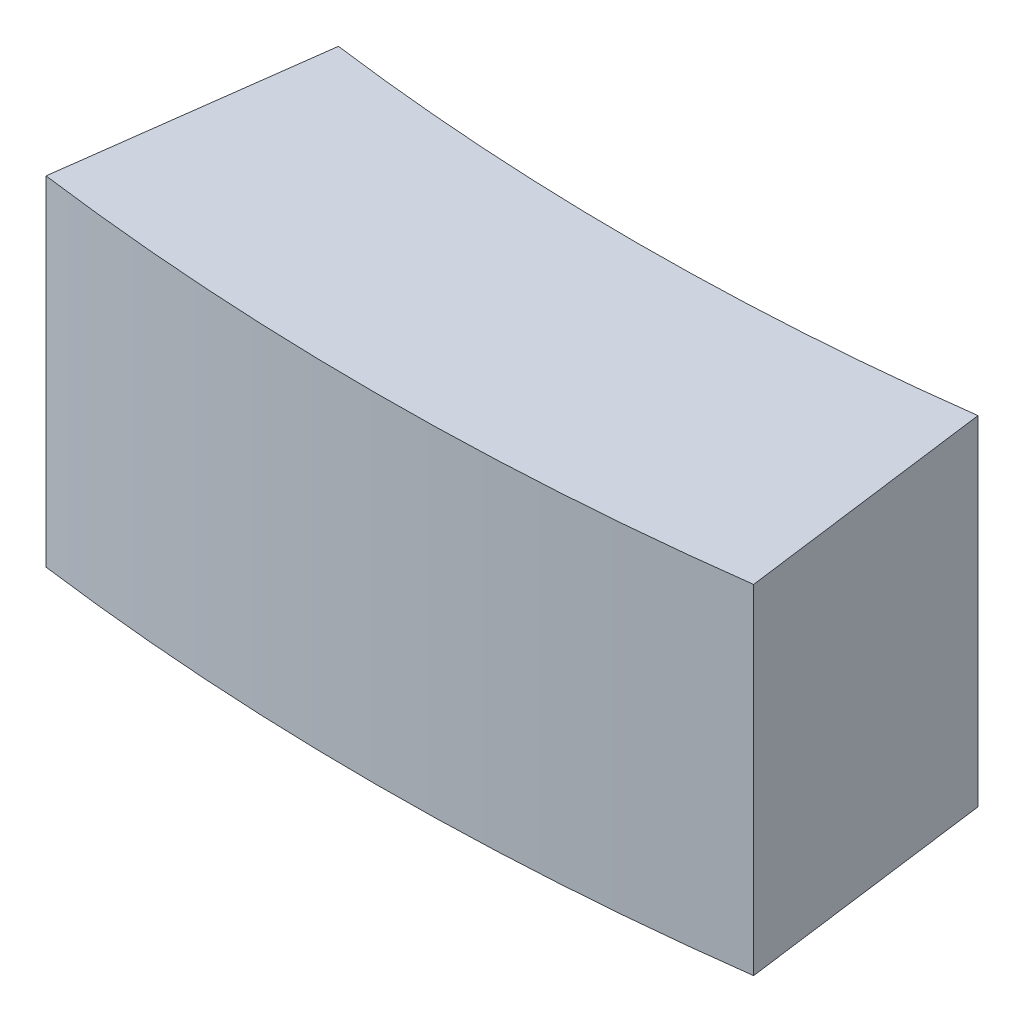
ISO-10303-21;
HEADER;
FILE_DESCRIPTION(('STEP AP214'),'2;1');
FILE_NAME('part.step','',(''),(''),'','','');
FILE_SCHEMA(('AUTOMOTIVE_DESIGN { 1 0 10303 214 1 1 1 1 }'));
ENDSEC;
DATA;
#1=APPLICATION_CONTEXT('core data for automotive mechanical design processes');
#2=APPLICATION_PROTOCOL_DEFINITION('international standard','automotive_design',2000,#1);
#3=PRODUCT_CONTEXT('',#1,'mechanical');
#4=PRODUCT('Part','Part','',(#3));
#5=PRODUCT_RELATED_PRODUCT_CATEGORY('part','',(#4));
#6=PRODUCT_DEFINITION_FORMATION('','',#4);
#7=PRODUCT_DEFINITION_CONTEXT('part definition',#1,'design');
#8=PRODUCT_DEFINITION('design','',#6,#7);
#9=PRODUCT_DEFINITION_SHAPE('','',#8);
#10=(LENGTH_UNIT() NAMED_UNIT(*) SI_UNIT(.MILLI.,.METRE.));
#11=(NAMED_UNIT(*) PLANE_ANGLE_UNIT() SI_UNIT($,.RADIAN.));
#12=(NAMED_UNIT(*) SI_UNIT($,.STERADIAN.) SOLID_ANGLE_UNIT());
#13=UNCERTAINTY_MEASURE_WITH_UNIT(LENGTH_MEASURE(1.E-05),#10,'distance_accuracy_value','');
#14=(GEOMETRIC_REPRESENTATION_CONTEXT(3) GLOBAL_UNCERTAINTY_ASSIGNED_CONTEXT((#13)) GLOBAL_UNIT_ASSIGNED_CONTEXT((#10,
#11,#12)) REPRESENTATION_CONTEXT('',''));
#15=CARTESIAN_POINT('',(0.,0.,0.));
#16=DIRECTION('',(0.,0.,1.));
#17=DIRECTION('',(1.,0.,0.));
#18=AXIS2_PLACEMENT_3D('',#15,#16,#17);
#19=CARTESIAN_POINT('',(0.,13.,-104.));
#20=DIRECTION('',(0.,-1.,0.));
#21=DIRECTION('',(0.,0.,-1.));
#22=AXIS2_PLACEMENT_3D('',#19,#20,#21);
#23=CYLINDRICAL_SURFACE('',#22,94.);
#24=DIRECTION('',(0.,1.,0.));
#25=VECTOR('',#24,1.);
#26=CARTESIAN_POINT('',(-12.2694620686842,13.,-10.8041830308617));
#27=LINE('',#26,#25);
#28=CARTESIAN_POINT('',(-12.2694620686842,0.,-10.8041830308617));
#29=VERTEX_POINT('',#28);
#30=CARTESIAN_POINT('',(-12.2694620686842,13.,-10.8041830308617));
#31=VERTEX_POINT('',#30);
#32=EDGE_CURVE('E82',#29,#31,#27,.T.);
#33=ORIENTED_EDGE('',*,*,#32,.T.);
#34=CARTESIAN_POINT('',(0.,13.,-104.));
#35=DIRECTION('',(0.,-1.,0.));
#36=DIRECTION('',(0.,0.,-1.));
#37=AXIS2_PLACEMENT_3D('',#34,#35,#36);
#38=CIRCLE('',#37,94.);
#39=CARTESIAN_POINT('',(12.2694620686849,13.,-10.8041830308618));
#40=VERTEX_POINT('',#39);
#41=EDGE_CURVE('E59',#40,#31,#38,.T.);
#42=ORIENTED_EDGE('',*,*,#41,.F.);
#43=DIRECTION('',(0.,1.,0.));
#44=VECTOR('',#43,1.);
#45=CARTESIAN_POINT('',(12.2694620686849,13.,-10.8041830308618));
#46=LINE('',#45,#44);
#47=CARTESIAN_POINT('',(12.2694620686849,0.,-10.8041830308618));
#48=VERTEX_POINT('',#47);
#49=EDGE_CURVE('E56',#40,#48,#46,.F.);
#50=ORIENTED_EDGE('',*,*,#49,.T.);
#51=CARTESIAN_POINT('',(0.,0.,-104.));
#52=DIRECTION('',(0.,-1.,0.));
#53=DIRECTION('',(0.,0.,-1.));
#54=AXIS2_PLACEMENT_3D('',#51,#52,#53);
#55=CIRCLE('',#54,94.);
#56=EDGE_CURVE('E20',#48,#29,#55,.T.);
#57=ORIENTED_EDGE('',*,*,#56,.T.);
#58=EDGE_LOOP('',(#33,#42,#50,#57));
#59=FACE_BOUND('',#58,.T.);
#60=ADVANCED_FACE('F17',(#59),#23,.F.);
#61=CARTESIAN_POINT('',(0.,0.,-104.));
#62=DIRECTION('',(0.,1.,0.));
#63=DIRECTION('',(0.,0.,1.));
#64=AXIS2_PLACEMENT_3D('',#61,#62,#63);
#65=PLANE('',#64);
#66=DIRECTION('',(0.130526192220045,0.,-0.991444861373811));
#67=VECTOR('',#66,1.);
#68=CARTESIAN_POINT('',(-13.5747239908846,0.,-0.889734417123617));
#69=LINE('',#68,#67);
#70=CARTESIAN_POINT('',(-13.5747239908846,0.,-0.889734417123589));
#71=VERTEX_POINT('',#70);
#72=EDGE_CURVE('E69',#71,#29,#69,.T.);
#73=ORIENTED_EDGE('',*,*,#72,.T.);
#74=ORIENTED_EDGE('',*,*,#56,.F.);
#75=DIRECTION('',(0.130526192220053,0.,0.99144486137381));
#76=VECTOR('',#75,1.);
#77=CARTESIAN_POINT('',(13.5747239908855,0.,-0.889734417123728));
#78=LINE('',#77,#76);
#79=CARTESIAN_POINT('',(13.5747239908855,0.,-0.889734417123693));
#80=VERTEX_POINT('',#79);
#81=EDGE_CURVE('E63',#48,#80,#78,.T.);
#82=ORIENTED_EDGE('',*,*,#81,.T.);
#83=CARTESIAN_POINT('',(0.,0.,-104.));
#84=DIRECTION('',(0.,-1.,0.));
#85=DIRECTION('',(0.,0.,-1.));
#86=AXIS2_PLACEMENT_3D('',#83,#84,#85);
#87=CIRCLE('',#86,104.);
#88=EDGE_CURVE('E81',#71,#80,#87,.F.);
#89=ORIENTED_EDGE('',*,*,#88,.F.);
#90=EDGE_LOOP('',(#73,#74,#82,#89));
#91=FACE_BOUND('',#90,.T.);
#92=ADVANCED_FACE('F66',(#91),#65,.F.);
#93=CARTESIAN_POINT('',(13.5747239908855,13.,-0.889734417123728));
#94=DIRECTION('',(-0.99144486137381,0.,0.130526192220053));
#95=DIRECTION('',(0.130526192220053,0.,0.99144486137381));
#96=AXIS2_PLACEMENT_3D('',#93,#94,#95);
#97=PLANE('',#96);
#98=ORIENTED_EDGE('',*,*,#49,.F.);
#99=DIRECTION('',(-0.130526192220056,0.,-0.99144486137381));
#100=VECTOR('',#99,1.);
#101=CARTESIAN_POINT('',(13.5747239908855,13.,-0.889734417123728));
#102=LINE('',#101,#100);
#103=CARTESIAN_POINT('',(13.5747239908855,13.,-0.889734417123707));
#104=VERTEX_POINT('',#103);
#105=EDGE_CURVE('E75',#104,#40,#102,.T.);
#106=ORIENTED_EDGE('',*,*,#105,.F.);
#107=DIRECTION('',(0.,-1.,0.));
#108=VECTOR('',#107,1.);
#109=CARTESIAN_POINT('',(13.5747239908855,13.,-0.8897344171237));
#110=LINE('',#109,#108);
#111=EDGE_CURVE('E73',#80,#104,#110,.F.);
#112=ORIENTED_EDGE('',*,*,#111,.F.);
#113=ORIENTED_EDGE('',*,*,#81,.F.);
#114=EDGE_LOOP('',(#98,#106,#112,#113));
#115=FACE_BOUND('',#114,.T.);
#116=ADVANCED_FACE('F71',(#115),#97,.F.);
#117=CARTESIAN_POINT('',(0.,13.,-104.));
#118=DIRECTION('',(0.,1.,0.));
#119=DIRECTION('',(0.,0.,1.));
#120=AXIS2_PLACEMENT_3D('',#117,#118,#119);
#121=PLANE('',#120);
#122=ORIENTED_EDGE('',*,*,#41,.T.);
#123=DIRECTION('',(0.130526192220045,0.,-0.991444861373811));
#124=VECTOR('',#123,1.);
#125=CARTESIAN_POINT('',(-13.5747239908846,13.,-0.889734417123617));
#126=LINE('',#125,#124);
#127=CARTESIAN_POINT('',(-13.5747239908846,13.,-0.889734417123589));
#128=VERTEX_POINT('',#127);
#129=EDGE_CURVE('E35',#31,#128,#126,.F.);
#130=ORIENTED_EDGE('',*,*,#129,.T.);
#131=CARTESIAN_POINT('',(0.,13.,-104.));
#132=DIRECTION('',(0.,-1.,0.));
#133=DIRECTION('',(0.,0.,-1.));
#134=AXIS2_PLACEMENT_3D('',#131,#132,#133);
#135=CIRCLE('',#134,104.);
#136=EDGE_CURVE('E26',#104,#128,#135,.T.);
#137=ORIENTED_EDGE('',*,*,#136,.F.);
#138=ORIENTED_EDGE('',*,*,#105,.T.);
#139=EDGE_LOOP('',(#122,#130,#137,#138));
#140=FACE_BOUND('',#139,.T.);
#141=ADVANCED_FACE('F86',(#140),#121,.T.);
#142=CARTESIAN_POINT('',(-13.5747239908846,13.,-0.889734417123617));
#143=DIRECTION('',(0.991444861373811,0.,0.130526192220045));
#144=DIRECTION('',(0.130526192220045,0.,-0.991444861373811));
#145=AXIS2_PLACEMENT_3D('',#142,#143,#144);
#146=PLANE('',#145);
#147=DIRECTION('',(0.,-1.,0.));
#148=VECTOR('',#147,1.);
#149=CARTESIAN_POINT('',(-13.5747239908846,13.,-0.889734417123589));
#150=LINE('',#149,#148);
#151=EDGE_CURVE('E11',#128,#71,#150,.T.);
#152=ORIENTED_EDGE('',*,*,#151,.F.);
#153=ORIENTED_EDGE('',*,*,#129,.F.);
#154=ORIENTED_EDGE('',*,*,#32,.F.);
#155=ORIENTED_EDGE('',*,*,#72,.F.);
#156=EDGE_LOOP('',(#152,#153,#154,#155));
#157=FACE_BOUND('',#156,.T.);
#158=ADVANCED_FACE('F88',(#157),#146,.F.);
#159=CARTESIAN_POINT('',(0.,13.,-104.));
#160=DIRECTION('',(0.,-1.,0.));
#161=DIRECTION('',(0.,0.,-1.));
#162=AXIS2_PLACEMENT_3D('',#159,#160,#161);
#163=CYLINDRICAL_SURFACE('',#162,104.);
#164=ORIENTED_EDGE('',*,*,#136,.T.);
#165=ORIENTED_EDGE('',*,*,#151,.T.);
#166=ORIENTED_EDGE('',*,*,#88,.T.);
#167=ORIENTED_EDGE('',*,*,#111,.T.);
#168=EDGE_LOOP('',(#164,#165,#166,#167));
#169=FACE_BOUND('',#168,.T.);
#170=ADVANCED_FACE('F90',(#169),#163,.T.);
#171=CLOSED_SHELL('',(#60,#92,#116,#141,#158,#170));
#172=MANIFOLD_SOLID_BREP('B1',#171);
#173=ADVANCED_BREP_SHAPE_REPRESENTATION('',(#18,#172),#14);
#174=SHAPE_DEFINITION_REPRESENTATION(#9,#173);
ENDSEC;
END-ISO-10303-21;
